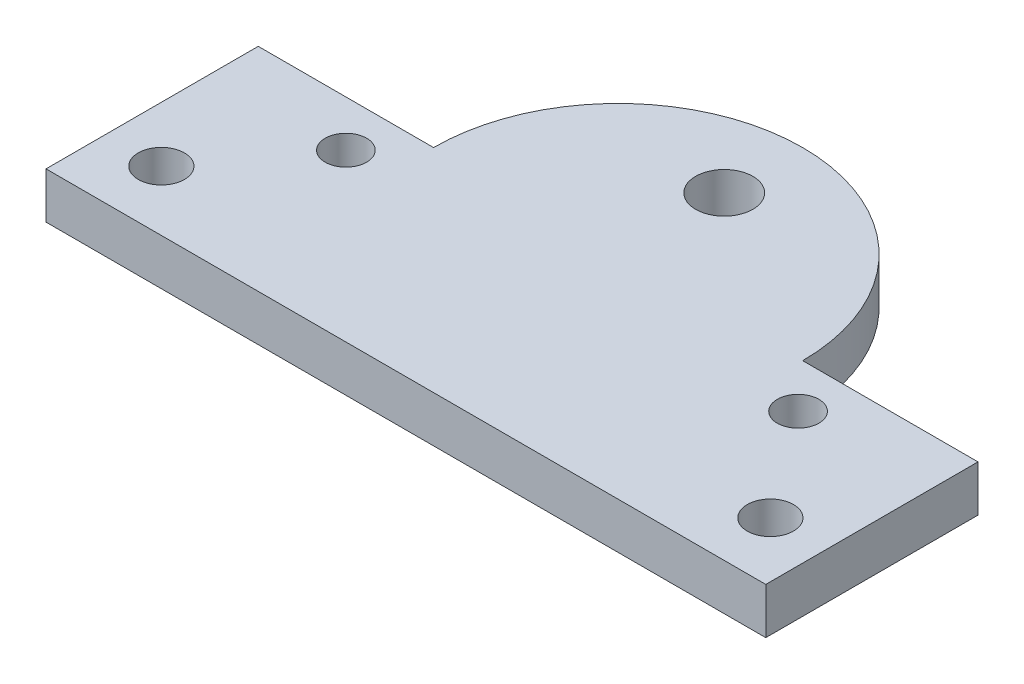
ISO-10303-21;
HEADER;
FILE_DESCRIPTION(('STEP AP214'),'2;1');
FILE_NAME('part.step','',(''),(''),'','','');
FILE_SCHEMA(('AUTOMOTIVE_DESIGN { 1 0 10303 214 1 1 1 1 }'));
ENDSEC;
DATA;
#1=APPLICATION_CONTEXT('core data for automotive mechanical design processes');
#2=APPLICATION_PROTOCOL_DEFINITION('international standard','automotive_design',2000,#1);
#3=PRODUCT_CONTEXT('',#1,'mechanical');
#4=PRODUCT('Part','Part','',(#3));
#5=PRODUCT_RELATED_PRODUCT_CATEGORY('part','',(#4));
#6=PRODUCT_DEFINITION_FORMATION('','',#4);
#7=PRODUCT_DEFINITION_CONTEXT('part definition',#1,'design');
#8=PRODUCT_DEFINITION('design','',#6,#7);
#9=PRODUCT_DEFINITION_SHAPE('','',#8);
#10=(LENGTH_UNIT() NAMED_UNIT(*) SI_UNIT(.MILLI.,.METRE.));
#11=(NAMED_UNIT(*) PLANE_ANGLE_UNIT() SI_UNIT($,.RADIAN.));
#12=(NAMED_UNIT(*) SI_UNIT($,.STERADIAN.) SOLID_ANGLE_UNIT());
#13=UNCERTAINTY_MEASURE_WITH_UNIT(LENGTH_MEASURE(1.E-05),#10,'distance_accuracy_value','');
#14=(GEOMETRIC_REPRESENTATION_CONTEXT(3) GLOBAL_UNCERTAINTY_ASSIGNED_CONTEXT((#13)) GLOBAL_UNIT_ASSIGNED_CONTEXT((#10,
#11,#12)) REPRESENTATION_CONTEXT('',''));
#15=CARTESIAN_POINT('',(0.,0.,0.));
#16=DIRECTION('',(0.,0.,1.));
#17=DIRECTION('',(1.,0.,0.));
#18=AXIS2_PLACEMENT_3D('',#15,#16,#17);
#19=CARTESIAN_POINT('',(0.,5.,-11.5));
#20=DIRECTION('',(0.,1.,0.));
#21=DIRECTION('',(0.,0.,1.));
#22=AXIS2_PLACEMENT_3D('',#19,#20,#21);
#23=PLANE('',#22);
#24=CARTESIAN_POINT('',(33.,5.,5.));
#25=DIRECTION('',(0.,1.,0.));
#26=DIRECTION('',(0.,0.,-1.));
#27=AXIS2_PLACEMENT_3D('',#24,#25,#26);
#28=CIRCLE('',#27,2.5);
#29=CARTESIAN_POINT('',(33.,5.,2.5));
#30=VERTEX_POINT('',#29);
#31=EDGE_CURVE('E193',#30,#30,#28,.T.);
#32=ORIENTED_EDGE('',*,*,#31,.F.);
#33=EDGE_LOOP('',(#32));
#34=FACE_BOUND('',#33,.T.);
#35=CARTESIAN_POINT('',(-24.5,5.,-6.5));
#36=DIRECTION('',(0.,1.,0.));
#37=DIRECTION('',(0.,0.,1.));
#38=AXIS2_PLACEMENT_3D('',#35,#36,#37);
#39=CIRCLE('',#38,2.25);
#40=CARTESIAN_POINT('',(-24.5,5.,-4.25));
#41=VERTEX_POINT('',#40);
#42=EDGE_CURVE('E205',#41,#41,#39,.T.);
#43=ORIENTED_EDGE('',*,*,#42,.F.);
#44=EDGE_LOOP('',(#43));
#45=FACE_BOUND('',#44,.T.);
#46=DIRECTION('',(0.,0.,-1.));
#47=VECTOR('',#46,1.);
#48=CARTESIAN_POINT('',(39.,5.,-11.5));
#49=LINE('',#48,#47);
#50=CARTESIAN_POINT('',(39.,5.,11.5));
#51=VERTEX_POINT('',#50);
#52=CARTESIAN_POINT('',(39.,5.,-11.5));
#53=VERTEX_POINT('',#52);
#54=EDGE_CURVE('E129',#51,#53,#49,.T.);
#55=ORIENTED_EDGE('',*,*,#54,.T.);
#56=DIRECTION('',(-1.,0.,0.));
#57=VECTOR('',#56,1.);
#58=CARTESIAN_POINT('',(20.,5.,-11.5));
#59=LINE('',#58,#57);
#60=CARTESIAN_POINT('',(20.,5.,-11.5));
#61=VERTEX_POINT('',#60);
#62=EDGE_CURVE('E87',#53,#61,#59,.T.);
#63=ORIENTED_EDGE('',*,*,#62,.T.);
#64=CARTESIAN_POINT('',(0.,5.,-11.5));
#65=DIRECTION('',(0.,1.,0.));
#66=DIRECTION('',(0.,0.,1.));
#67=AXIS2_PLACEMENT_3D('',#64,#65,#66);
#68=CIRCLE('',#67,20.);
#69=CARTESIAN_POINT('',(-20.,5.,-11.5));
#70=VERTEX_POINT('',#69);
#71=EDGE_CURVE('E100',#61,#70,#68,.T.);
#72=ORIENTED_EDGE('',*,*,#71,.T.);
#73=DIRECTION('',(-1.,0.,0.));
#74=VECTOR('',#73,1.);
#75=CARTESIAN_POINT('',(-39.,5.,-11.5));
#76=LINE('',#75,#74);
#77=CARTESIAN_POINT('',(-39.,5.,-11.5));
#78=VERTEX_POINT('',#77);
#79=EDGE_CURVE('E94',#70,#78,#76,.T.);
#80=ORIENTED_EDGE('',*,*,#79,.T.);
#81=DIRECTION('',(0.,0.,1.));
#82=VECTOR('',#81,1.);
#83=CARTESIAN_POINT('',(-39.,5.,-11.5));
#84=LINE('',#83,#82);
#85=CARTESIAN_POINT('',(-39.,5.,11.5));
#86=VERTEX_POINT('',#85);
#87=EDGE_CURVE('E98',#78,#86,#84,.T.);
#88=ORIENTED_EDGE('',*,*,#87,.T.);
#89=DIRECTION('',(1.,0.,0.));
#90=VECTOR('',#89,1.);
#91=CARTESIAN_POINT('',(-39.,5.,11.5));
#92=LINE('',#91,#90);
#93=EDGE_CURVE('E50',#86,#51,#92,.T.);
#94=ORIENTED_EDGE('',*,*,#93,.T.);
#95=EDGE_LOOP('',(#55,#63,#72,#80,#88,#94));
#96=FACE_BOUND('',#95,.T.);
#97=CARTESIAN_POINT('',(0.,5.,-23.));
#98=DIRECTION('',(0.,1.,0.));
#99=DIRECTION('',(0.,0.,1.));
#100=AXIS2_PLACEMENT_3D('',#97,#98,#99);
#101=CIRCLE('',#100,3.1);
#102=CARTESIAN_POINT('',(0.,5.,-19.9));
#103=VERTEX_POINT('',#102);
#104=EDGE_CURVE('E122',#103,#103,#101,.T.);
#105=ORIENTED_EDGE('',*,*,#104,.F.);
#106=EDGE_LOOP('',(#105));
#107=FACE_BOUND('',#106,.T.);
#108=CARTESIAN_POINT('',(-33.,5.,5.));
#109=DIRECTION('',(0.,1.,0.));
#110=DIRECTION('',(0.,0.,1.));
#111=AXIS2_PLACEMENT_3D('',#108,#109,#110);
#112=CIRCLE('',#111,2.5);
#113=CARTESIAN_POINT('',(-33.,5.,7.5));
#114=VERTEX_POINT('',#113);
#115=EDGE_CURVE('E199',#114,#114,#112,.T.);
#116=ORIENTED_EDGE('',*,*,#115,.F.);
#117=EDGE_LOOP('',(#116));
#118=FACE_BOUND('',#117,.T.);
#119=CARTESIAN_POINT('',(24.5,5.,-6.49999999999998));
#120=DIRECTION('',(0.,1.,0.));
#121=DIRECTION('',(0.,0.,-1.));
#122=AXIS2_PLACEMENT_3D('',#119,#120,#121);
#123=CIRCLE('',#122,2.25);
#124=CARTESIAN_POINT('',(24.5,5.,-8.74999999999998));
#125=VERTEX_POINT('',#124);
#126=EDGE_CURVE('E184',#125,#125,#123,.T.);
#127=ORIENTED_EDGE('',*,*,#126,.F.);
#128=EDGE_LOOP('',(#127));
#129=FACE_BOUND('',#128,.T.);
#130=ADVANCED_FACE('F33',(#34,#45,#96,#107,#118,#129),#23,.T.);
#131=CARTESIAN_POINT('',(0.,0.,-11.5));
#132=DIRECTION('',(0.,1.,0.));
#133=DIRECTION('',(0.,0.,1.));
#134=AXIS2_PLACEMENT_3D('',#131,#132,#133);
#135=PLANE('',#134);
#136=DIRECTION('',(0.,0.,-1.));
#137=VECTOR('',#136,1.);
#138=CARTESIAN_POINT('',(39.,0.,-11.5));
#139=LINE('',#138,#137);
#140=CARTESIAN_POINT('',(39.,0.,11.5));
#141=VERTEX_POINT('',#140);
#142=CARTESIAN_POINT('',(39.,0.,-11.5));
#143=VERTEX_POINT('',#142);
#144=EDGE_CURVE('E118',#141,#143,#139,.T.);
#145=ORIENTED_EDGE('',*,*,#144,.F.);
#146=DIRECTION('',(1.,0.,0.));
#147=VECTOR('',#146,1.);
#148=CARTESIAN_POINT('',(-39.,0.,11.5));
#149=LINE('',#148,#147);
#150=CARTESIAN_POINT('',(-39.,0.,11.5));
#151=VERTEX_POINT('',#150);
#152=EDGE_CURVE('E79',#151,#141,#149,.T.);
#153=ORIENTED_EDGE('',*,*,#152,.F.);
#154=DIRECTION('',(0.,0.,1.));
#155=VECTOR('',#154,1.);
#156=CARTESIAN_POINT('',(-39.,0.,-11.5));
#157=LINE('',#156,#155);
#158=CARTESIAN_POINT('',(-39.,0.,-11.5));
#159=VERTEX_POINT('',#158);
#160=EDGE_CURVE('E73',#159,#151,#157,.T.);
#161=ORIENTED_EDGE('',*,*,#160,.F.);
#162=DIRECTION('',(-1.,0.,0.));
#163=VECTOR('',#162,1.);
#164=CARTESIAN_POINT('',(-39.,0.,-11.5));
#165=LINE('',#164,#163);
#166=CARTESIAN_POINT('',(-20.,0.,-11.5));
#167=VERTEX_POINT('',#166);
#168=EDGE_CURVE('E108',#167,#159,#165,.T.);
#169=ORIENTED_EDGE('',*,*,#168,.F.);
#170=CARTESIAN_POINT('',(0.,0.,-11.5));
#171=DIRECTION('',(0.,1.,0.));
#172=DIRECTION('',(0.,0.,1.));
#173=AXIS2_PLACEMENT_3D('',#170,#171,#172);
#174=CIRCLE('',#173,20.);
#175=CARTESIAN_POINT('',(20.,0.,-11.5));
#176=VERTEX_POINT('',#175);
#177=EDGE_CURVE('E124',#176,#167,#174,.T.);
#178=ORIENTED_EDGE('',*,*,#177,.F.);
#179=DIRECTION('',(-1.,0.,0.));
#180=VECTOR('',#179,1.);
#181=CARTESIAN_POINT('',(20.,0.,-11.5));
#182=LINE('',#181,#180);
#183=EDGE_CURVE('E121',#143,#176,#182,.T.);
#184=ORIENTED_EDGE('',*,*,#183,.F.);
#185=EDGE_LOOP('',(#145,#153,#161,#169,#178,#184));
#186=FACE_BOUND('',#185,.T.);
#187=CARTESIAN_POINT('',(0.,0.,-23.));
#188=DIRECTION('',(0.,1.,0.));
#189=DIRECTION('',(0.,0.,1.));
#190=AXIS2_PLACEMENT_3D('',#187,#188,#189);
#191=CIRCLE('',#190,3.1);
#192=CARTESIAN_POINT('',(0.,0.,-19.9));
#193=VERTEX_POINT('',#192);
#194=EDGE_CURVE('E208',#193,#193,#191,.T.);
#195=ORIENTED_EDGE('',*,*,#194,.T.);
#196=EDGE_LOOP('',(#195));
#197=FACE_BOUND('',#196,.T.);
#198=CARTESIAN_POINT('',(-24.5,0.,-6.5));
#199=DIRECTION('',(0.,1.,0.));
#200=DIRECTION('',(0.,0.,1.));
#201=AXIS2_PLACEMENT_3D('',#198,#199,#200);
#202=CIRCLE('',#201,2.25);
#203=CARTESIAN_POINT('',(-24.5,0.,-4.25));
#204=VERTEX_POINT('',#203);
#205=EDGE_CURVE('E202',#204,#204,#202,.T.);
#206=ORIENTED_EDGE('',*,*,#205,.T.);
#207=EDGE_LOOP('',(#206));
#208=FACE_BOUND('',#207,.T.);
#209=CARTESIAN_POINT('',(-33.,0.,5.));
#210=DIRECTION('',(0.,1.,0.));
#211=DIRECTION('',(0.,0.,1.));
#212=AXIS2_PLACEMENT_3D('',#209,#210,#211);
#213=CIRCLE('',#212,2.5);
#214=CARTESIAN_POINT('',(-33.,0.,7.5));
#215=VERTEX_POINT('',#214);
#216=EDGE_CURVE('E196',#215,#215,#213,.T.);
#217=ORIENTED_EDGE('',*,*,#216,.T.);
#218=EDGE_LOOP('',(#217));
#219=FACE_BOUND('',#218,.T.);
#220=CARTESIAN_POINT('',(33.,0.,5.));
#221=DIRECTION('',(0.,1.,0.));
#222=DIRECTION('',(0.,0.,-1.));
#223=AXIS2_PLACEMENT_3D('',#220,#221,#222);
#224=CIRCLE('',#223,2.5);
#225=CARTESIAN_POINT('',(33.,0.,2.5));
#226=VERTEX_POINT('',#225);
#227=EDGE_CURVE('E190',#226,#226,#224,.T.);
#228=ORIENTED_EDGE('',*,*,#227,.T.);
#229=EDGE_LOOP('',(#228));
#230=FACE_BOUND('',#229,.T.);
#231=CARTESIAN_POINT('',(24.5,0.,-6.49999999999998));
#232=DIRECTION('',(0.,1.,0.));
#233=DIRECTION('',(0.,0.,-1.));
#234=AXIS2_PLACEMENT_3D('',#231,#232,#233);
#235=CIRCLE('',#234,2.25);
#236=CARTESIAN_POINT('',(24.5,0.,-8.74999999999998));
#237=VERTEX_POINT('',#236);
#238=EDGE_CURVE('E187',#237,#237,#235,.T.);
#239=ORIENTED_EDGE('',*,*,#238,.T.);
#240=EDGE_LOOP('',(#239));
#241=FACE_BOUND('',#240,.T.);
#242=ADVANCED_FACE('F138',(#186,#197,#208,#219,#230,#241),#135,.F.);
#243=CARTESIAN_POINT('',(39.,5.,-11.5));
#244=DIRECTION('',(-1.,0.,0.));
#245=DIRECTION('',(0.,0.,1.));
#246=AXIS2_PLACEMENT_3D('',#243,#244,#245);
#247=PLANE('',#246);
#248=ORIENTED_EDGE('',*,*,#144,.T.);
#249=DIRECTION('',(0.,-1.,0.));
#250=VECTOR('',#249,1.);
#251=CARTESIAN_POINT('',(39.,5.,-11.5));
#252=LINE('',#251,#250);
#253=EDGE_CURVE('E11',#53,#143,#252,.T.);
#254=ORIENTED_EDGE('',*,*,#253,.F.);
#255=ORIENTED_EDGE('',*,*,#54,.F.);
#256=DIRECTION('',(0.,-1.,0.));
#257=VECTOR('',#256,1.);
#258=CARTESIAN_POINT('',(39.,5.,11.5));
#259=LINE('',#258,#257);
#260=EDGE_CURVE('E114',#51,#141,#259,.T.);
#261=ORIENTED_EDGE('',*,*,#260,.T.);
#262=EDGE_LOOP('',(#248,#254,#255,#261));
#263=FACE_BOUND('',#262,.T.);
#264=ADVANCED_FACE('F35',(#263),#247,.F.);
#265=CARTESIAN_POINT('',(20.,5.,-11.5));
#266=DIRECTION('',(0.,0.,1.));
#267=DIRECTION('',(1.,0.,0.));
#268=AXIS2_PLACEMENT_3D('',#265,#266,#267);
#269=PLANE('',#268);
#270=ORIENTED_EDGE('',*,*,#183,.T.);
#271=DIRECTION('',(0.,-1.,0.));
#272=VECTOR('',#271,1.);
#273=CARTESIAN_POINT('',(20.,5.,-11.5));
#274=LINE('',#273,#272);
#275=EDGE_CURVE('E42',#61,#176,#274,.T.);
#276=ORIENTED_EDGE('',*,*,#275,.F.);
#277=ORIENTED_EDGE('',*,*,#62,.F.);
#278=ORIENTED_EDGE('',*,*,#253,.T.);
#279=EDGE_LOOP('',(#270,#276,#277,#278));
#280=FACE_BOUND('',#279,.T.);
#281=ADVANCED_FACE('F275',(#280),#269,.F.);
#282=CARTESIAN_POINT('',(0.,5.,-11.5));
#283=DIRECTION('',(0.,-1.,0.));
#284=DIRECTION('',(0.,0.,-1.));
#285=AXIS2_PLACEMENT_3D('',#282,#283,#284);
#286=CYLINDRICAL_SURFACE('',#285,20.);
#287=ORIENTED_EDGE('',*,*,#177,.T.);
#288=DIRECTION('',(0.,-1.,0.));
#289=VECTOR('',#288,1.);
#290=CARTESIAN_POINT('',(-20.,5.,-11.5));
#291=LINE('',#290,#289);
#292=EDGE_CURVE('E109',#70,#167,#291,.T.);
#293=ORIENTED_EDGE('',*,*,#292,.F.);
#294=ORIENTED_EDGE('',*,*,#71,.F.);
#295=ORIENTED_EDGE('',*,*,#275,.T.);
#296=EDGE_LOOP('',(#287,#293,#294,#295));
#297=FACE_BOUND('',#296,.T.);
#298=ADVANCED_FACE('F135',(#297),#286,.T.);
#299=CARTESIAN_POINT('',(-39.,5.,-11.5));
#300=DIRECTION('',(0.,0.,1.));
#301=DIRECTION('',(1.,0.,0.));
#302=AXIS2_PLACEMENT_3D('',#299,#300,#301);
#303=PLANE('',#302);
#304=ORIENTED_EDGE('',*,*,#168,.T.);
#305=DIRECTION('',(0.,-1.,0.));
#306=VECTOR('',#305,1.);
#307=CARTESIAN_POINT('',(-39.,5.,-11.5));
#308=LINE('',#307,#306);
#309=EDGE_CURVE('E105',#78,#159,#308,.T.);
#310=ORIENTED_EDGE('',*,*,#309,.F.);
#311=ORIENTED_EDGE('',*,*,#79,.F.);
#312=ORIENTED_EDGE('',*,*,#292,.T.);
#313=EDGE_LOOP('',(#304,#310,#311,#312));
#314=FACE_BOUND('',#313,.T.);
#315=ADVANCED_FACE('F106',(#314),#303,.F.);
#316=CARTESIAN_POINT('',(-39.,5.,-11.5));
#317=DIRECTION('',(1.,0.,0.));
#318=DIRECTION('',(0.,0.,-1.));
#319=AXIS2_PLACEMENT_3D('',#316,#317,#318);
#320=PLANE('',#319);
#321=ORIENTED_EDGE('',*,*,#160,.T.);
#322=DIRECTION('',(0.,-1.,0.));
#323=VECTOR('',#322,1.);
#324=CARTESIAN_POINT('',(-39.,5.,11.5));
#325=LINE('',#324,#323);
#326=EDGE_CURVE('E110',#86,#151,#325,.T.);
#327=ORIENTED_EDGE('',*,*,#326,.F.);
#328=ORIENTED_EDGE('',*,*,#87,.F.);
#329=ORIENTED_EDGE('',*,*,#309,.T.);
#330=EDGE_LOOP('',(#321,#327,#328,#329));
#331=FACE_BOUND('',#330,.T.);
#332=ADVANCED_FACE('F112',(#331),#320,.F.);
#333=CARTESIAN_POINT('',(-39.,5.,11.5));
#334=DIRECTION('',(0.,0.,-1.));
#335=DIRECTION('',(-1.,0.,0.));
#336=AXIS2_PLACEMENT_3D('',#333,#334,#335);
#337=PLANE('',#336);
#338=ORIENTED_EDGE('',*,*,#152,.T.);
#339=ORIENTED_EDGE('',*,*,#260,.F.);
#340=ORIENTED_EDGE('',*,*,#93,.F.);
#341=ORIENTED_EDGE('',*,*,#326,.T.);
#342=EDGE_LOOP('',(#338,#339,#340,#341));
#343=FACE_BOUND('',#342,.T.);
#344=ADVANCED_FACE('F143',(#343),#337,.F.);
#345=CARTESIAN_POINT('',(0.,5.,-23.));
#346=DIRECTION('',(0.,-1.,0.));
#347=DIRECTION('',(0.,0.,-1.));
#348=AXIS2_PLACEMENT_3D('',#345,#346,#347);
#349=CYLINDRICAL_SURFACE('',#348,3.1);
#350=ORIENTED_EDGE('',*,*,#104,.T.);
#351=EDGE_LOOP('',(#350));
#352=FACE_BOUND('',#351,.T.);
#353=ORIENTED_EDGE('',*,*,#194,.F.);
#354=EDGE_LOOP('',(#353));
#355=FACE_BOUND('',#354,.T.);
#356=ADVANCED_FACE('F145',(#352,#355),#349,.F.);
#357=CARTESIAN_POINT('',(-24.5,5.,-6.5));
#358=DIRECTION('',(0.,-1.,0.));
#359=DIRECTION('',(0.,0.,-1.));
#360=AXIS2_PLACEMENT_3D('',#357,#358,#359);
#361=CYLINDRICAL_SURFACE('',#360,2.25);
#362=ORIENTED_EDGE('',*,*,#42,.T.);
#363=EDGE_LOOP('',(#362));
#364=FACE_BOUND('',#363,.T.);
#365=ORIENTED_EDGE('',*,*,#205,.F.);
#366=EDGE_LOOP('',(#365));
#367=FACE_BOUND('',#366,.T.);
#368=ADVANCED_FACE('F151',(#364,#367),#361,.F.);
#369=CARTESIAN_POINT('',(-33.,5.,5.));
#370=DIRECTION('',(0.,-1.,0.));
#371=DIRECTION('',(0.,0.,-1.));
#372=AXIS2_PLACEMENT_3D('',#369,#370,#371);
#373=CYLINDRICAL_SURFACE('',#372,2.5);
#374=ORIENTED_EDGE('',*,*,#115,.T.);
#375=EDGE_LOOP('',(#374));
#376=FACE_BOUND('',#375,.T.);
#377=ORIENTED_EDGE('',*,*,#216,.F.);
#378=EDGE_LOOP('',(#377));
#379=FACE_BOUND('',#378,.T.);
#380=ADVANCED_FACE('F167',(#376,#379),#373,.F.);
#381=CARTESIAN_POINT('',(33.,5.,5.));
#382=DIRECTION('',(0.,-1.,0.));
#383=DIRECTION('',(0.,0.,-1.));
#384=AXIS2_PLACEMENT_3D('',#381,#382,#383);
#385=CYLINDRICAL_SURFACE('',#384,2.5);
#386=ORIENTED_EDGE('',*,*,#31,.T.);
#387=EDGE_LOOP('',(#386));
#388=FACE_BOUND('',#387,.T.);
#389=ORIENTED_EDGE('',*,*,#227,.F.);
#390=EDGE_LOOP('',(#389));
#391=FACE_BOUND('',#390,.T.);
#392=ADVANCED_FACE('F171',(#388,#391),#385,.F.);
#393=CARTESIAN_POINT('',(24.5,5.,-6.49999999999998));
#394=DIRECTION('',(0.,-1.,0.));
#395=DIRECTION('',(0.,0.,-1.));
#396=AXIS2_PLACEMENT_3D('',#393,#394,#395);
#397=CYLINDRICAL_SURFACE('',#396,2.25);
#398=ORIENTED_EDGE('',*,*,#126,.T.);
#399=EDGE_LOOP('',(#398));
#400=FACE_BOUND('',#399,.T.);
#401=ORIENTED_EDGE('',*,*,#238,.F.);
#402=EDGE_LOOP('',(#401));
#403=FACE_BOUND('',#402,.T.);
#404=ADVANCED_FACE('F175',(#400,#403),#397,.F.);
#405=CLOSED_SHELL('',(#130,#242,#264,#281,#298,#315,#332,#344,#356,#368,#380,#392,#404));
#406=MANIFOLD_SOLID_BREP('B2',#405);
#407=ADVANCED_BREP_SHAPE_REPRESENTATION('',(#18,#406),#14);
#408=SHAPE_DEFINITION_REPRESENTATION(#9,#407);
ENDSEC;
END-ISO-10303-21;
